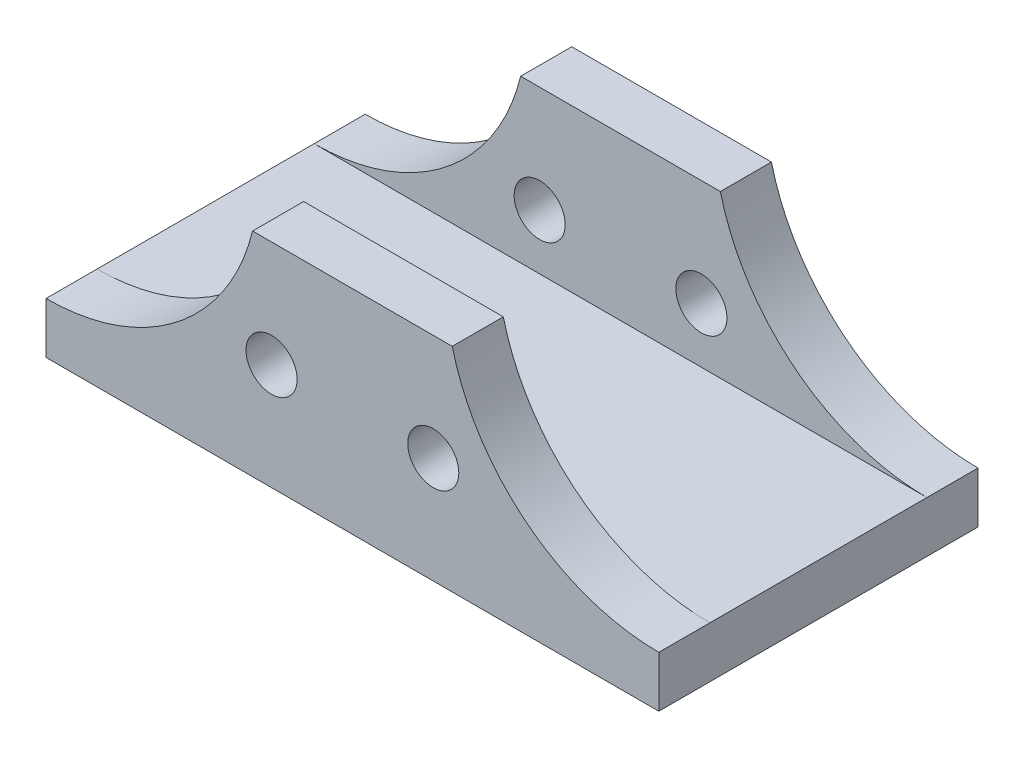
ISO-10303-21;
HEADER;
FILE_DESCRIPTION(('STEP AP214'),'2;1');
FILE_NAME('part.step','',(''),(''),'','','');
FILE_SCHEMA(('AUTOMOTIVE_DESIGN { 1 0 10303 214 1 1 1 1 }'));
ENDSEC;
DATA;
#1=APPLICATION_CONTEXT('core data for automotive mechanical design processes');
#2=APPLICATION_PROTOCOL_DEFINITION('international standard','automotive_design',2000,#1);
#3=PRODUCT_CONTEXT('',#1,'mechanical');
#4=PRODUCT('Part','Part','',(#3));
#5=PRODUCT_RELATED_PRODUCT_CATEGORY('part','',(#4));
#6=PRODUCT_DEFINITION_FORMATION('','',#4);
#7=PRODUCT_DEFINITION_CONTEXT('part definition',#1,'design');
#8=PRODUCT_DEFINITION('design','',#6,#7);
#9=PRODUCT_DEFINITION_SHAPE('','',#8);
#10=(LENGTH_UNIT() NAMED_UNIT(*) SI_UNIT(.MILLI.,.METRE.));
#11=(NAMED_UNIT(*) PLANE_ANGLE_UNIT() SI_UNIT($,.RADIAN.));
#12=(NAMED_UNIT(*) SI_UNIT($,.STERADIAN.) SOLID_ANGLE_UNIT());
#13=UNCERTAINTY_MEASURE_WITH_UNIT(LENGTH_MEASURE(1.E-05),#10,'distance_accuracy_value','');
#14=(GEOMETRIC_REPRESENTATION_CONTEXT(3) GLOBAL_UNCERTAINTY_ASSIGNED_CONTEXT((#13)) GLOBAL_UNIT_ASSIGNED_CONTEXT((#10,
#11,#12)) REPRESENTATION_CONTEXT('',''));
#15=CARTESIAN_POINT('',(0.,0.,0.));
#16=DIRECTION('',(0.,0.,1.));
#17=DIRECTION('',(1.,0.,0.));
#18=AXIS2_PLACEMENT_3D('',#15,#16,#17);
#19=CARTESIAN_POINT('',(-72.,25.,37.5));
#20=DIRECTION('',(0.,-1.,0.));
#21=DIRECTION('',(0.,0.,-1.));
#22=AXIS2_PLACEMENT_3D('',#19,#20,#21);
#23=PLANE('',#22);
#24=DIRECTION('',(0.,0.,1.));
#25=VECTOR('',#24,1.);
#26=CARTESIAN_POINT('',(23.4613556019536,25.,-37.5));
#27=LINE('',#26,#25);
#28=CARTESIAN_POINT('',(23.4613556019536,25.,25.5));
#29=VERTEX_POINT('',#28);
#30=CARTESIAN_POINT('',(23.4613556019536,25.,37.5));
#31=VERTEX_POINT('',#30);
#32=EDGE_CURVE('E171',#29,#31,#27,.T.);
#33=ORIENTED_EDGE('',*,*,#32,.F.);
#34=DIRECTION('',(1.,0.,0.));
#35=VECTOR('',#34,1.);
#36=CARTESIAN_POINT('',(-72.,25.,25.5));
#37=LINE('',#36,#35);
#38=CARTESIAN_POINT('',(-23.4613556019536,25.,25.5));
#39=VERTEX_POINT('',#38);
#40=EDGE_CURVE('E142',#39,#29,#37,.T.);
#41=ORIENTED_EDGE('',*,*,#40,.F.);
#42=DIRECTION('',(0.,0.,1.));
#43=VECTOR('',#42,1.);
#44=CARTESIAN_POINT('',(-23.4613556019536,25.,-37.5));
#45=LINE('',#44,#43);
#46=CARTESIAN_POINT('',(-23.4613556019536,25.,37.5));
#47=VERTEX_POINT('',#46);
#48=EDGE_CURVE('E248',#39,#47,#45,.T.);
#49=ORIENTED_EDGE('',*,*,#48,.T.);
#50=DIRECTION('',(-1.,0.,0.));
#51=VECTOR('',#50,1.);
#52=CARTESIAN_POINT('',(-72.,25.,37.5));
#53=LINE('',#52,#51);
#54=EDGE_CURVE('E180',#31,#47,#53,.T.);
#55=ORIENTED_EDGE('',*,*,#54,.F.);
#56=EDGE_LOOP('',(#33,#41,#49,#55));
#57=FACE_BOUND('',#56,.T.);
#58=ADVANCED_FACE('F45',(#57),#23,.F.);
#59=CARTESIAN_POINT('',(72.,37.,-37.5));
#60=DIRECTION('',(0.,0.,1.));
#61=DIRECTION('',(1.,0.,0.));
#62=AXIS2_PLACEMENT_3D('',#59,#60,#61);
#63=CYLINDRICAL_SURFACE('',#62,50.);
#64=DIRECTION('',(0.,0.,1.));
#65=VECTOR('',#64,1.);
#66=CARTESIAN_POINT('',(72.,-13.,-37.5));
#67=LINE('',#66,#65);
#68=CARTESIAN_POINT('',(72.,-13.,25.5));
#69=VERTEX_POINT('',#68);
#70=CARTESIAN_POINT('',(72.,-13.,37.5));
#71=VERTEX_POINT('',#70);
#72=EDGE_CURVE('E160',#69,#71,#67,.T.);
#73=ORIENTED_EDGE('',*,*,#72,.F.);
#74=CARTESIAN_POINT('',(72.,37.,25.5));
#75=DIRECTION('',(0.,0.,1.));
#76=DIRECTION('',(1.,0.,0.));
#77=AXIS2_PLACEMENT_3D('',#74,#75,#76);
#78=CIRCLE('',#77,50.);
#79=EDGE_CURVE('E152',#69,#29,#78,.F.);
#80=ORIENTED_EDGE('',*,*,#79,.T.);
#81=ORIENTED_EDGE('',*,*,#32,.T.);
#82=CARTESIAN_POINT('',(72.,37.,37.5));
#83=DIRECTION('',(0.,0.,1.));
#84=DIRECTION('',(-1.,0.,0.));
#85=AXIS2_PLACEMENT_3D('',#82,#83,#84);
#86=CIRCLE('',#85,50.);
#87=EDGE_CURVE('E164',#31,#71,#86,.T.);
#88=ORIENTED_EDGE('',*,*,#87,.T.);
#89=EDGE_LOOP('',(#73,#80,#81,#88));
#90=FACE_BOUND('',#89,.T.);
#91=ADVANCED_FACE('F274',(#90),#63,.F.);
#92=CARTESIAN_POINT('',(-72.,37.,-37.5));
#93=DIRECTION('',(0.,0.,1.));
#94=DIRECTION('',(1.,0.,0.));
#95=AXIS2_PLACEMENT_3D('',#92,#93,#94);
#96=CYLINDRICAL_SURFACE('',#95,50.);
#97=ORIENTED_EDGE('',*,*,#48,.F.);
#98=CARTESIAN_POINT('',(-72.,37.,25.5));
#99=DIRECTION('',(0.,0.,1.));
#100=DIRECTION('',(1.,0.,0.));
#101=AXIS2_PLACEMENT_3D('',#98,#99,#100);
#102=CIRCLE('',#101,50.);
#103=CARTESIAN_POINT('',(-72.,-13.,25.5));
#104=VERTEX_POINT('',#103);
#105=EDGE_CURVE('E11',#39,#104,#102,.F.);
#106=ORIENTED_EDGE('',*,*,#105,.T.);
#107=DIRECTION('',(0.,0.,1.));
#108=VECTOR('',#107,1.);
#109=CARTESIAN_POINT('',(-72.,-13.,-37.5));
#110=LINE('',#109,#108);
#111=CARTESIAN_POINT('',(-72.,-13.,37.5));
#112=VERTEX_POINT('',#111);
#113=EDGE_CURVE('E253',#104,#112,#110,.T.);
#114=ORIENTED_EDGE('',*,*,#113,.T.);
#115=CARTESIAN_POINT('',(-72.,37.,37.5));
#116=DIRECTION('',(0.,0.,1.));
#117=DIRECTION('',(1.,0.,0.));
#118=AXIS2_PLACEMENT_3D('',#115,#116,#117);
#119=CIRCLE('',#118,50.);
#120=EDGE_CURVE('E174',#112,#47,#119,.T.);
#121=ORIENTED_EDGE('',*,*,#120,.T.);
#122=EDGE_LOOP('',(#97,#106,#114,#121));
#123=FACE_BOUND('',#122,.T.);
#124=ADVANCED_FACE('F267',(#123),#96,.F.);
#125=CARTESIAN_POINT('',(72.,25.,37.5));
#126=DIRECTION('',(-1.,0.,0.));
#127=DIRECTION('',(0.,-1.,0.));
#128=AXIS2_PLACEMENT_3D('',#125,#126,#127);
#129=PLANE('',#128);
#130=DIRECTION('',(0.,1.,0.));
#131=VECTOR('',#130,1.);
#132=CARTESIAN_POINT('',(72.,25.,-37.5));
#133=LINE('',#132,#131);
#134=CARTESIAN_POINT('',(72.,-25.,-37.5));
#135=VERTEX_POINT('',#134);
#136=CARTESIAN_POINT('',(72.,-13.,-37.5));
#137=VERTEX_POINT('',#136);
#138=EDGE_CURVE('E157',#135,#137,#133,.T.);
#139=ORIENTED_EDGE('',*,*,#138,.T.);
#140=CARTESIAN_POINT('',(72.,-13.,-25.5));
#141=VERTEX_POINT('',#140);
#142=EDGE_CURVE('E147',#137,#141,#67,.T.);
#143=ORIENTED_EDGE('',*,*,#142,.T.);
#144=DIRECTION('',(0.,0.,-1.));
#145=VECTOR('',#144,1.);
#146=CARTESIAN_POINT('',(72.,-13.,-25.5));
#147=LINE('',#146,#145);
#148=EDGE_CURVE('E131',#69,#141,#147,.T.);
#149=ORIENTED_EDGE('',*,*,#148,.F.);
#150=ORIENTED_EDGE('',*,*,#72,.T.);
#151=DIRECTION('',(0.,1.,0.));
#152=VECTOR('',#151,1.);
#153=CARTESIAN_POINT('',(72.,25.,37.5));
#154=LINE('',#153,#152);
#155=CARTESIAN_POINT('',(72.,-25.,37.5));
#156=VERTEX_POINT('',#155);
#157=EDGE_CURVE('E176',#156,#71,#154,.T.);
#158=ORIENTED_EDGE('',*,*,#157,.F.);
#159=DIRECTION('',(0.,0.,-1.));
#160=VECTOR('',#159,1.);
#161=CARTESIAN_POINT('',(72.,-25.,37.5));
#162=LINE('',#161,#160);
#163=EDGE_CURVE('E191',#156,#135,#162,.T.);
#164=ORIENTED_EDGE('',*,*,#163,.T.);
#165=EDGE_LOOP('',(#139,#143,#149,#150,#158,#164));
#166=FACE_BOUND('',#165,.T.);
#167=ADVANCED_FACE('F47',(#166),#129,.F.);
#168=CARTESIAN_POINT('',(-23.4613556019536,25.,-37.5));
#169=VERTEX_POINT('',#168);
#170=CARTESIAN_POINT('',(-23.4613556019536,25.,-25.5));
#171=VERTEX_POINT('',#170);
#172=EDGE_CURVE('E71',#169,#171,#45,.T.);
#173=ORIENTED_EDGE('',*,*,#172,.T.);
#174=DIRECTION('',(-1.,0.,0.));
#175=VECTOR('',#174,1.);
#176=CARTESIAN_POINT('',(-72.,25.,-25.5));
#177=LINE('',#176,#175);
#178=CARTESIAN_POINT('',(23.4613556019536,25.,-25.5));
#179=VERTEX_POINT('',#178);
#180=EDGE_CURVE('E221',#179,#171,#177,.T.);
#181=ORIENTED_EDGE('',*,*,#180,.F.);
#182=CARTESIAN_POINT('',(23.4613556019536,25.,-37.5));
#183=VERTEX_POINT('',#182);
#184=EDGE_CURVE('E150',#183,#179,#27,.T.);
#185=ORIENTED_EDGE('',*,*,#184,.F.);
#186=DIRECTION('',(-1.,0.,0.));
#187=VECTOR('',#186,1.);
#188=CARTESIAN_POINT('',(-72.,25.,-37.5));
#189=LINE('',#188,#187);
#190=EDGE_CURVE('E194',#183,#169,#189,.T.);
#191=ORIENTED_EDGE('',*,*,#190,.T.);
#192=EDGE_LOOP('',(#173,#181,#185,#191));
#193=FACE_BOUND('',#192,.T.);
#194=ADVANCED_FACE('F290',(#193),#23,.F.);
#195=CARTESIAN_POINT('',(-72.,25.,37.5));
#196=DIRECTION('',(1.,0.,0.));
#197=DIRECTION('',(0.,1.,0.));
#198=AXIS2_PLACEMENT_3D('',#195,#196,#197);
#199=PLANE('',#198);
#200=DIRECTION('',(0.,-1.,0.));
#201=VECTOR('',#200,1.);
#202=CARTESIAN_POINT('',(-72.,25.,37.5));
#203=LINE('',#202,#201);
#204=CARTESIAN_POINT('',(-72.,-25.,37.5));
#205=VERTEX_POINT('',#204);
#206=EDGE_CURVE('E185',#112,#205,#203,.T.);
#207=ORIENTED_EDGE('',*,*,#206,.F.);
#208=ORIENTED_EDGE('',*,*,#113,.F.);
#209=DIRECTION('',(0.,0.,1.));
#210=VECTOR('',#209,1.);
#211=CARTESIAN_POINT('',(-72.,-13.,-25.5));
#212=LINE('',#211,#210);
#213=CARTESIAN_POINT('',(-72.,-13.,-25.5));
#214=VERTEX_POINT('',#213);
#215=EDGE_CURVE('E130',#214,#104,#212,.T.);
#216=ORIENTED_EDGE('',*,*,#215,.F.);
#217=CARTESIAN_POINT('',(-72.,-13.,-37.5));
#218=VERTEX_POINT('',#217);
#219=EDGE_CURVE('E195',#218,#214,#110,.T.);
#220=ORIENTED_EDGE('',*,*,#219,.F.);
#221=DIRECTION('',(0.,-1.,0.));
#222=VECTOR('',#221,1.);
#223=CARTESIAN_POINT('',(-72.,25.,-37.5));
#224=LINE('',#223,#222);
#225=CARTESIAN_POINT('',(-72.,-25.,-37.5));
#226=VERTEX_POINT('',#225);
#227=EDGE_CURVE('E199',#218,#226,#224,.T.);
#228=ORIENTED_EDGE('',*,*,#227,.T.);
#229=DIRECTION('',(0.,0.,-1.));
#230=VECTOR('',#229,1.);
#231=CARTESIAN_POINT('',(-72.,-25.,37.5));
#232=LINE('',#231,#230);
#233=EDGE_CURVE('E206',#205,#226,#232,.T.);
#234=ORIENTED_EDGE('',*,*,#233,.F.);
#235=EDGE_LOOP('',(#207,#208,#216,#220,#228,#234));
#236=FACE_BOUND('',#235,.T.);
#237=ADVANCED_FACE('F279',(#236),#199,.F.);
#238=CARTESIAN_POINT('',(-72.,-25.,37.5));
#239=DIRECTION('',(0.,1.,0.));
#240=DIRECTION('',(0.,0.,1.));
#241=AXIS2_PLACEMENT_3D('',#238,#239,#240);
#242=PLANE('',#241);
#243=DIRECTION('',(1.,0.,0.));
#244=VECTOR('',#243,1.);
#245=CARTESIAN_POINT('',(-72.,-25.,-37.5));
#246=LINE('',#245,#244);
#247=EDGE_CURVE('E181',#226,#135,#246,.T.);
#248=ORIENTED_EDGE('',*,*,#247,.T.);
#249=ORIENTED_EDGE('',*,*,#163,.F.);
#250=DIRECTION('',(1.,0.,0.));
#251=VECTOR('',#250,1.);
#252=CARTESIAN_POINT('',(-72.,-25.,37.5));
#253=LINE('',#252,#251);
#254=EDGE_CURVE('E188',#205,#156,#253,.T.);
#255=ORIENTED_EDGE('',*,*,#254,.F.);
#256=ORIENTED_EDGE('',*,*,#233,.T.);
#257=EDGE_LOOP('',(#248,#249,#255,#256));
#258=FACE_BOUND('',#257,.T.);
#259=ADVANCED_FACE('F284',(#258),#242,.F.);
#260=CARTESIAN_POINT('',(0.,0.,37.5));
#261=DIRECTION('',(0.,0.,1.));
#262=DIRECTION('',(1.,0.,0.));
#263=AXIS2_PLACEMENT_3D('',#260,#261,#262);
#264=PLANE('',#263);
#265=CARTESIAN_POINT('',(19.,0.,37.5));
#266=DIRECTION('',(0.,0.,1.));
#267=DIRECTION('',(1.,0.,0.));
#268=AXIS2_PLACEMENT_3D('',#265,#266,#267);
#269=CIRCLE('',#268,6.00000000000001);
#270=CARTESIAN_POINT('',(25.,0.,37.5));
#271=VERTEX_POINT('',#270);
#272=EDGE_CURVE('E444',#271,#271,#269,.T.);
#273=ORIENTED_EDGE('',*,*,#272,.F.);
#274=EDGE_LOOP('',(#273));
#275=FACE_BOUND('',#274,.T.);
#276=CARTESIAN_POINT('',(-19.,0.,37.5));
#277=DIRECTION('',(0.,0.,1.));
#278=DIRECTION('',(1.,0.,0.));
#279=AXIS2_PLACEMENT_3D('',#276,#277,#278);
#280=CIRCLE('',#279,6.00000000000001);
#281=CARTESIAN_POINT('',(-13.,0.,37.5));
#282=VERTEX_POINT('',#281);
#283=EDGE_CURVE('E224',#282,#282,#280,.T.);
#284=ORIENTED_EDGE('',*,*,#283,.F.);
#285=EDGE_LOOP('',(#284));
#286=FACE_BOUND('',#285,.T.);
#287=ORIENTED_EDGE('',*,*,#120,.F.);
#288=ORIENTED_EDGE('',*,*,#206,.T.);
#289=ORIENTED_EDGE('',*,*,#254,.T.);
#290=ORIENTED_EDGE('',*,*,#157,.T.);
#291=ORIENTED_EDGE('',*,*,#87,.F.);
#292=ORIENTED_EDGE('',*,*,#54,.T.);
#293=EDGE_LOOP('',(#287,#288,#289,#290,#291,#292));
#294=FACE_BOUND('',#293,.T.);
#295=ADVANCED_FACE('F271',(#275,#286,#294),#264,.T.);
#296=CARTESIAN_POINT('',(0.,0.,-37.5));
#297=DIRECTION('',(0.,0.,1.));
#298=DIRECTION('',(1.,0.,0.));
#299=AXIS2_PLACEMENT_3D('',#296,#297,#298);
#300=PLANE('',#299);
#301=CARTESIAN_POINT('',(19.,0.,-37.5));
#302=DIRECTION('',(0.,0.,1.));
#303=DIRECTION('',(1.,0.,0.));
#304=AXIS2_PLACEMENT_3D('',#301,#302,#303);
#305=CIRCLE('',#304,6.00000000000001);
#306=CARTESIAN_POINT('',(25.,0.,-37.5));
#307=VERTEX_POINT('',#306);
#308=EDGE_CURVE('E448',#307,#307,#305,.T.);
#309=ORIENTED_EDGE('',*,*,#308,.T.);
#310=EDGE_LOOP('',(#309));
#311=FACE_BOUND('',#310,.T.);
#312=CARTESIAN_POINT('',(-19.,0.,-37.5));
#313=DIRECTION('',(0.,0.,1.));
#314=DIRECTION('',(1.,0.,0.));
#315=AXIS2_PLACEMENT_3D('',#312,#313,#314);
#316=CIRCLE('',#315,6.00000000000001);
#317=CARTESIAN_POINT('',(-13.,0.,-37.5));
#318=VERTEX_POINT('',#317);
#319=EDGE_CURVE('E215',#318,#318,#316,.T.);
#320=ORIENTED_EDGE('',*,*,#319,.T.);
#321=EDGE_LOOP('',(#320));
#322=FACE_BOUND('',#321,.T.);
#323=ORIENTED_EDGE('',*,*,#227,.F.);
#324=CARTESIAN_POINT('',(-72.,37.,-37.5));
#325=DIRECTION('',(0.,0.,1.));
#326=DIRECTION('',(1.,0.,0.));
#327=AXIS2_PLACEMENT_3D('',#324,#325,#326);
#328=CIRCLE('',#327,50.);
#329=EDGE_CURVE('E245',#218,#169,#328,.T.);
#330=ORIENTED_EDGE('',*,*,#329,.T.);
#331=ORIENTED_EDGE('',*,*,#190,.F.);
#332=CARTESIAN_POINT('',(72.,37.,-37.5));
#333=DIRECTION('',(0.,0.,1.));
#334=DIRECTION('',(-1.,0.,0.));
#335=AXIS2_PLACEMENT_3D('',#332,#333,#334);
#336=CIRCLE('',#335,50.);
#337=EDGE_CURVE('E159',#183,#137,#336,.T.);
#338=ORIENTED_EDGE('',*,*,#337,.T.);
#339=ORIENTED_EDGE('',*,*,#138,.F.);
#340=ORIENTED_EDGE('',*,*,#247,.F.);
#341=EDGE_LOOP('',(#323,#330,#331,#338,#339,#340));
#342=FACE_BOUND('',#341,.T.);
#343=ADVANCED_FACE('F288',(#311,#322,#342),#300,.F.);
#344=ORIENTED_EDGE('',*,*,#184,.T.);
#345=CARTESIAN_POINT('',(72.,37.,-25.5));
#346=DIRECTION('',(0.,0.,-1.));
#347=DIRECTION('',(-1.,0.,0.));
#348=AXIS2_PLACEMENT_3D('',#345,#346,#347);
#349=CIRCLE('',#348,50.);
#350=EDGE_CURVE('E126',#179,#141,#349,.F.);
#351=ORIENTED_EDGE('',*,*,#350,.T.);
#352=ORIENTED_EDGE('',*,*,#142,.F.);
#353=ORIENTED_EDGE('',*,*,#337,.F.);
#354=EDGE_LOOP('',(#344,#351,#352,#353));
#355=FACE_BOUND('',#354,.T.);
#356=ADVANCED_FACE('F146',(#355),#63,.F.);
#357=ORIENTED_EDGE('',*,*,#219,.T.);
#358=CARTESIAN_POINT('',(-72.,37.,-25.5));
#359=DIRECTION('',(0.,0.,-1.));
#360=DIRECTION('',(-1.,0.,0.));
#361=AXIS2_PLACEMENT_3D('',#358,#359,#360);
#362=CIRCLE('',#361,50.);
#363=EDGE_CURVE('E55',#214,#171,#362,.F.);
#364=ORIENTED_EDGE('',*,*,#363,.T.);
#365=ORIENTED_EDGE('',*,*,#172,.F.);
#366=ORIENTED_EDGE('',*,*,#329,.F.);
#367=EDGE_LOOP('',(#357,#364,#365,#366));
#368=FACE_BOUND('',#367,.T.);
#369=ADVANCED_FACE('F291',(#368),#96,.F.);
#370=CARTESIAN_POINT('',(-72.,-13.,25.5));
#371=DIRECTION('',(0.,0.,1.));
#372=DIRECTION('',(1.,0.,0.));
#373=AXIS2_PLACEMENT_3D('',#370,#371,#372);
#374=PLANE('',#373);
#375=CARTESIAN_POINT('',(19.,0.,25.5));
#376=DIRECTION('',(0.,0.,1.));
#377=DIRECTION('',(1.,0.,0.));
#378=AXIS2_PLACEMENT_3D('',#375,#376,#377);
#379=CIRCLE('',#378,6.00000000000001);
#380=CARTESIAN_POINT('',(25.,0.,25.5));
#381=VERTEX_POINT('',#380);
#382=EDGE_CURVE('E230',#381,#381,#379,.T.);
#383=ORIENTED_EDGE('',*,*,#382,.T.);
#384=EDGE_LOOP('',(#383));
#385=FACE_BOUND('',#384,.T.);
#386=CARTESIAN_POINT('',(-19.,0.,25.5));
#387=DIRECTION('',(0.,0.,1.));
#388=DIRECTION('',(1.,0.,0.));
#389=AXIS2_PLACEMENT_3D('',#386,#387,#388);
#390=CIRCLE('',#389,6.00000000000001);
#391=CARTESIAN_POINT('',(-13.,0.,25.5));
#392=VERTEX_POINT('',#391);
#393=EDGE_CURVE('E211',#392,#392,#390,.T.);
#394=ORIENTED_EDGE('',*,*,#393,.T.);
#395=EDGE_LOOP('',(#394));
#396=FACE_BOUND('',#395,.T.);
#397=DIRECTION('',(1.,0.,0.));
#398=VECTOR('',#397,1.);
#399=CARTESIAN_POINT('',(-72.,-13.,25.5));
#400=LINE('',#399,#398);
#401=EDGE_CURVE('E137',#104,#69,#400,.T.);
#402=ORIENTED_EDGE('',*,*,#401,.F.);
#403=ORIENTED_EDGE('',*,*,#105,.F.);
#404=ORIENTED_EDGE('',*,*,#40,.T.);
#405=ORIENTED_EDGE('',*,*,#79,.F.);
#406=EDGE_LOOP('',(#402,#403,#404,#405));
#407=FACE_BOUND('',#406,.T.);
#408=ADVANCED_FACE('F277',(#385,#396,#407),#374,.F.);
#409=CARTESIAN_POINT('',(-72.,-13.,-25.5));
#410=DIRECTION('',(0.,0.,-1.));
#411=DIRECTION('',(-1.,0.,0.));
#412=AXIS2_PLACEMENT_3D('',#409,#410,#411);
#413=PLANE('',#412);
#414=CARTESIAN_POINT('',(19.,0.,-25.5));
#415=DIRECTION('',(0.,0.,-1.));
#416=DIRECTION('',(-1.,0.,0.));
#417=AXIS2_PLACEMENT_3D('',#414,#415,#416);
#418=CIRCLE('',#417,6.00000000000001);
#419=CARTESIAN_POINT('',(13.,0.,-25.5));
#420=VERTEX_POINT('',#419);
#421=EDGE_CURVE('E49',#420,#420,#418,.T.);
#422=ORIENTED_EDGE('',*,*,#421,.T.);
#423=EDGE_LOOP('',(#422));
#424=FACE_BOUND('',#423,.T.);
#425=CARTESIAN_POINT('',(-19.,0.,-25.5));
#426=DIRECTION('',(0.,0.,-1.));
#427=DIRECTION('',(-1.,0.,0.));
#428=AXIS2_PLACEMENT_3D('',#425,#426,#427);
#429=CIRCLE('',#428,6.00000000000001);
#430=CARTESIAN_POINT('',(-25.,0.,-25.5));
#431=VERTEX_POINT('',#430);
#432=EDGE_CURVE('E214',#431,#431,#429,.T.);
#433=ORIENTED_EDGE('',*,*,#432,.T.);
#434=EDGE_LOOP('',(#433));
#435=FACE_BOUND('',#434,.T.);
#436=ORIENTED_EDGE('',*,*,#180,.T.);
#437=ORIENTED_EDGE('',*,*,#363,.F.);
#438=DIRECTION('',(-1.,0.,0.));
#439=VECTOR('',#438,1.);
#440=CARTESIAN_POINT('',(-72.,-13.,-25.5));
#441=LINE('',#440,#439);
#442=EDGE_CURVE('E63',#141,#214,#441,.T.);
#443=ORIENTED_EDGE('',*,*,#442,.F.);
#444=ORIENTED_EDGE('',*,*,#350,.F.);
#445=EDGE_LOOP('',(#436,#437,#443,#444));
#446=FACE_BOUND('',#445,.T.);
#447=ADVANCED_FACE('F124',(#424,#435,#446),#413,.F.);
#448=CARTESIAN_POINT('',(0.,-13.,0.));
#449=DIRECTION('',(0.,1.,0.));
#450=DIRECTION('',(0.,0.,1.));
#451=AXIS2_PLACEMENT_3D('',#448,#449,#450);
#452=PLANE('',#451);
#453=ORIENTED_EDGE('',*,*,#148,.T.);
#454=ORIENTED_EDGE('',*,*,#442,.T.);
#455=ORIENTED_EDGE('',*,*,#215,.T.);
#456=ORIENTED_EDGE('',*,*,#401,.T.);
#457=EDGE_LOOP('',(#453,#454,#455,#456));
#458=FACE_BOUND('',#457,.T.);
#459=ADVANCED_FACE('F135',(#458),#452,.T.);
#460=CARTESIAN_POINT('',(-19.,0.,37.5));
#461=DIRECTION('',(0.,0.,1.));
#462=DIRECTION('',(1.,0.,0.));
#463=AXIS2_PLACEMENT_3D('',#460,#461,#462);
#464=CYLINDRICAL_SURFACE('',#463,6.00000000000001);
#465=ORIENTED_EDGE('',*,*,#283,.T.);
#466=EDGE_LOOP('',(#465));
#467=FACE_BOUND('',#466,.T.);
#468=ORIENTED_EDGE('',*,*,#393,.F.);
#469=EDGE_LOOP('',(#468));
#470=FACE_BOUND('',#469,.T.);
#471=ADVANCED_FACE('F351',(#467,#470),#464,.F.);
#472=ORIENTED_EDGE('',*,*,#319,.F.);
#473=EDGE_LOOP('',(#472));
#474=FACE_BOUND('',#473,.T.);
#475=ORIENTED_EDGE('',*,*,#432,.F.);
#476=EDGE_LOOP('',(#475));
#477=FACE_BOUND('',#476,.T.);
#478=ADVANCED_FACE('F359',(#474,#477),#464,.F.);
#479=CARTESIAN_POINT('',(19.,0.,37.5));
#480=DIRECTION('',(0.,0.,1.));
#481=DIRECTION('',(1.,0.,0.));
#482=AXIS2_PLACEMENT_3D('',#479,#480,#481);
#483=CYLINDRICAL_SURFACE('',#482,6.00000000000001);
#484=ORIENTED_EDGE('',*,*,#308,.F.);
#485=EDGE_LOOP('',(#484));
#486=FACE_BOUND('',#485,.T.);
#487=ORIENTED_EDGE('',*,*,#421,.F.);
#488=EDGE_LOOP('',(#487));
#489=FACE_BOUND('',#488,.T.);
#490=ADVANCED_FACE('F368',(#486,#489),#483,.F.);
#491=ORIENTED_EDGE('',*,*,#272,.T.);
#492=EDGE_LOOP('',(#491));
#493=FACE_BOUND('',#492,.T.);
#494=ORIENTED_EDGE('',*,*,#382,.F.);
#495=EDGE_LOOP('',(#494));
#496=FACE_BOUND('',#495,.T.);
#497=ADVANCED_FACE('F376',(#493,#496),#483,.F.);
#498=CLOSED_SHELL('',(#58,#91,#124,#167,#194,#237,#259,#295,#343,#356,#369,#408,#447,#459,#471,
#478,#490,#497));
#499=MANIFOLD_SOLID_BREP('B2',#498);
#500=ADVANCED_BREP_SHAPE_REPRESENTATION('',(#18,#499),#14);
#501=SHAPE_DEFINITION_REPRESENTATION(#9,#500);
ENDSEC;
END-ISO-10303-21;
